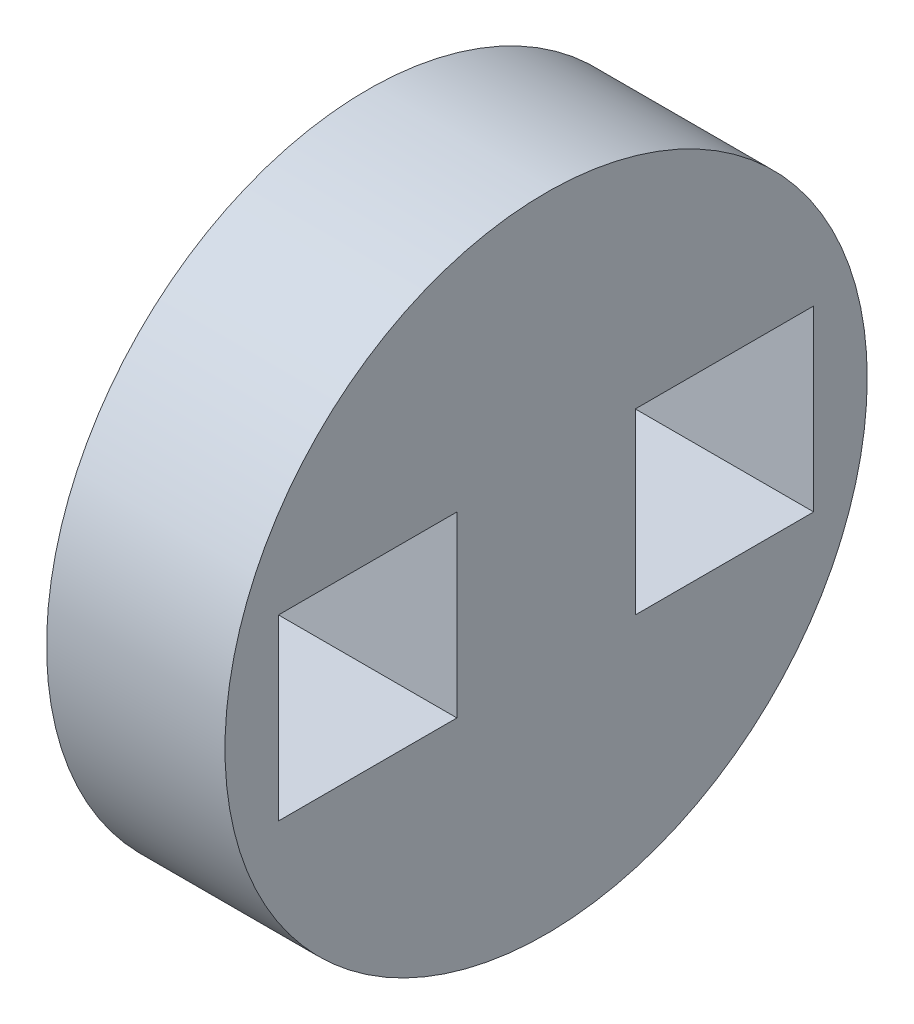
ISO-10303-21;
HEADER;
FILE_DESCRIPTION(('STEP AP214'),'2;1');
FILE_NAME('part.step','',(''),(''),'','','');
FILE_SCHEMA(('AUTOMOTIVE_DESIGN { 1 0 10303 214 1 1 1 1 }'));
ENDSEC;
DATA;
#1=APPLICATION_CONTEXT('core data for automotive mechanical design processes');
#2=APPLICATION_PROTOCOL_DEFINITION('international standard','automotive_design',2000,#1);
#3=PRODUCT_CONTEXT('',#1,'mechanical');
#4=PRODUCT('Part','Part','',(#3));
#5=PRODUCT_RELATED_PRODUCT_CATEGORY('part','',(#4));
#6=PRODUCT_DEFINITION_FORMATION('','',#4);
#7=PRODUCT_DEFINITION_CONTEXT('part definition',#1,'design');
#8=PRODUCT_DEFINITION('design','',#6,#7);
#9=PRODUCT_DEFINITION_SHAPE('','',#8);
#10=(LENGTH_UNIT() NAMED_UNIT(*) SI_UNIT(.MILLI.,.METRE.));
#11=(NAMED_UNIT(*) PLANE_ANGLE_UNIT() SI_UNIT($,.RADIAN.));
#12=(NAMED_UNIT(*) SI_UNIT($,.STERADIAN.) SOLID_ANGLE_UNIT());
#13=UNCERTAINTY_MEASURE_WITH_UNIT(LENGTH_MEASURE(1.E-05),#10,'distance_accuracy_value','');
#14=(GEOMETRIC_REPRESENTATION_CONTEXT(3) GLOBAL_UNCERTAINTY_ASSIGNED_CONTEXT((#13)) GLOBAL_UNIT_ASSIGNED_CONTEXT((#10,
#11,#12)) REPRESENTATION_CONTEXT('',''));
#15=CARTESIAN_POINT('',(0.,0.,0.));
#16=DIRECTION('',(0.,0.,1.));
#17=DIRECTION('',(1.,0.,0.));
#18=AXIS2_PLACEMENT_3D('',#15,#16,#17);
#19=CARTESIAN_POINT('',(6.35,0.,0.));
#20=DIRECTION('',(1.,0.,0.));
#21=DIRECTION('',(0.,0.,-1.));
#22=AXIS2_PLACEMENT_3D('',#19,#20,#21);
#23=PLANE('',#22);
#24=DIRECTION('',(0.,0.,1.));
#25=VECTOR('',#24,1.);
#26=CARTESIAN_POINT('',(6.35,3.175,9.525));
#27=LINE('',#26,#25);
#28=CARTESIAN_POINT('',(6.35,3.175,3.175));
#29=VERTEX_POINT('',#28);
#30=CARTESIAN_POINT('',(6.35,3.175,9.525));
#31=VERTEX_POINT('',#30);
#32=EDGE_CURVE('E136',#29,#31,#27,.T.);
#33=ORIENTED_EDGE('',*,*,#32,.F.);
#34=DIRECTION('',(0.,1.,0.));
#35=VECTOR('',#34,1.);
#36=CARTESIAN_POINT('',(6.35,3.175,3.175));
#37=LINE('',#36,#35);
#38=CARTESIAN_POINT('',(6.35,-3.175,3.175));
#39=VERTEX_POINT('',#38);
#40=EDGE_CURVE('E134',#39,#29,#37,.T.);
#41=ORIENTED_EDGE('',*,*,#40,.F.);
#42=DIRECTION('',(0.,0.,-1.));
#43=VECTOR('',#42,1.);
#44=CARTESIAN_POINT('',(6.35,-3.175,9.525));
#45=LINE('',#44,#43);
#46=CARTESIAN_POINT('',(6.35,-3.175,9.525));
#47=VERTEX_POINT('',#46);
#48=EDGE_CURVE('E142',#47,#39,#45,.T.);
#49=ORIENTED_EDGE('',*,*,#48,.F.);
#50=DIRECTION('',(0.,-1.,0.));
#51=VECTOR('',#50,1.);
#52=CARTESIAN_POINT('',(6.35,3.175,9.525));
#53=LINE('',#52,#51);
#54=EDGE_CURVE('E139',#31,#47,#53,.T.);
#55=ORIENTED_EDGE('',*,*,#54,.F.);
#56=EDGE_LOOP('',(#33,#41,#49,#55));
#57=FACE_BOUND('',#56,.T.);
#58=CARTESIAN_POINT('',(6.35,0.,0.));
#59=DIRECTION('',(1.,0.,0.));
#60=DIRECTION('',(0.,0.,-1.));
#61=AXIS2_PLACEMENT_3D('',#58,#59,#60);
#62=CIRCLE('',#61,11.43);
#63=CARTESIAN_POINT('',(6.35,0.,-11.43));
#64=VERTEX_POINT('',#63);
#65=EDGE_CURVE('E11',#64,#64,#62,.T.);
#66=ORIENTED_EDGE('',*,*,#65,.T.);
#67=EDGE_LOOP('',(#66));
#68=FACE_BOUND('',#67,.T.);
#69=DIRECTION('',(0.,0.,-1.));
#70=VECTOR('',#69,1.);
#71=CARTESIAN_POINT('',(6.35,-3.175,-9.525));
#72=LINE('',#71,#70);
#73=CARTESIAN_POINT('',(6.35,-3.175,-3.175));
#74=VERTEX_POINT('',#73);
#75=CARTESIAN_POINT('',(6.35,-3.175,-9.525));
#76=VERTEX_POINT('',#75);
#77=EDGE_CURVE('E106',#74,#76,#72,.T.);
#78=ORIENTED_EDGE('',*,*,#77,.F.);
#79=DIRECTION('',(0.,-1.,0.));
#80=VECTOR('',#79,1.);
#81=CARTESIAN_POINT('',(6.35,3.175,-3.175));
#82=LINE('',#81,#80);
#83=CARTESIAN_POINT('',(6.35,3.175,-3.175));
#84=VERTEX_POINT('',#83);
#85=EDGE_CURVE('E98',#84,#74,#82,.T.);
#86=ORIENTED_EDGE('',*,*,#85,.F.);
#87=DIRECTION('',(0.,0.,1.));
#88=VECTOR('',#87,1.);
#89=CARTESIAN_POINT('',(6.35,3.175,-9.525));
#90=LINE('',#89,#88);
#91=CARTESIAN_POINT('',(6.35,3.175,-9.525));
#92=VERTEX_POINT('',#91);
#93=EDGE_CURVE('E120',#92,#84,#90,.T.);
#94=ORIENTED_EDGE('',*,*,#93,.F.);
#95=DIRECTION('',(0.,1.,0.));
#96=VECTOR('',#95,1.);
#97=CARTESIAN_POINT('',(6.35,3.175,-9.525));
#98=LINE('',#97,#96);
#99=EDGE_CURVE('E118',#76,#92,#98,.T.);
#100=ORIENTED_EDGE('',*,*,#99,.F.);
#101=EDGE_LOOP('',(#78,#86,#94,#100));
#102=FACE_BOUND('',#101,.T.);
#103=ADVANCED_FACE('F33',(#57,#68,#102),#23,.T.);
#104=CARTESIAN_POINT('',(0.,0.,0.));
#105=DIRECTION('',(1.,0.,0.));
#106=DIRECTION('',(0.,0.,-1.));
#107=AXIS2_PLACEMENT_3D('',#104,#105,#106);
#108=PLANE('',#107);
#109=DIRECTION('',(0.,1.,0.));
#110=VECTOR('',#109,1.);
#111=CARTESIAN_POINT('',(0.,3.175,3.175));
#112=LINE('',#111,#110);
#113=CARTESIAN_POINT('',(0.,-3.175,3.175));
#114=VERTEX_POINT('',#113);
#115=CARTESIAN_POINT('',(0.,3.175,3.175));
#116=VERTEX_POINT('',#115);
#117=EDGE_CURVE('E114',#114,#116,#112,.T.);
#118=ORIENTED_EDGE('',*,*,#117,.T.);
#119=DIRECTION('',(0.,0.,1.));
#120=VECTOR('',#119,1.);
#121=CARTESIAN_POINT('',(0.,3.175,9.525));
#122=LINE('',#121,#120);
#123=CARTESIAN_POINT('',(0.,3.175,9.525));
#124=VERTEX_POINT('',#123);
#125=EDGE_CURVE('E147',#116,#124,#122,.T.);
#126=ORIENTED_EDGE('',*,*,#125,.T.);
#127=DIRECTION('',(0.,-1.,0.));
#128=VECTOR('',#127,1.);
#129=CARTESIAN_POINT('',(0.,3.175,9.525));
#130=LINE('',#129,#128);
#131=CARTESIAN_POINT('',(0.,-3.175,9.525));
#132=VERTEX_POINT('',#131);
#133=EDGE_CURVE('E150',#124,#132,#130,.T.);
#134=ORIENTED_EDGE('',*,*,#133,.T.);
#135=DIRECTION('',(0.,0.,-1.));
#136=VECTOR('',#135,1.);
#137=CARTESIAN_POINT('',(0.,-3.175,9.525));
#138=LINE('',#137,#136);
#139=EDGE_CURVE('E137',#132,#114,#138,.T.);
#140=ORIENTED_EDGE('',*,*,#139,.T.);
#141=EDGE_LOOP('',(#118,#126,#134,#140));
#142=FACE_BOUND('',#141,.T.);
#143=CARTESIAN_POINT('',(0.,0.,0.));
#144=DIRECTION('',(1.,0.,0.));
#145=DIRECTION('',(0.,0.,-1.));
#146=AXIS2_PLACEMENT_3D('',#143,#144,#145);
#147=CIRCLE('',#146,11.43);
#148=CARTESIAN_POINT('',(0.,0.,-11.43));
#149=VERTEX_POINT('',#148);
#150=EDGE_CURVE('E37',#149,#149,#147,.T.);
#151=ORIENTED_EDGE('',*,*,#150,.F.);
#152=EDGE_LOOP('',(#151));
#153=FACE_BOUND('',#152,.T.);
#154=DIRECTION('',(0.,-1.,0.));
#155=VECTOR('',#154,1.);
#156=CARTESIAN_POINT('',(0.,3.175,-3.175));
#157=LINE('',#156,#155);
#158=CARTESIAN_POINT('',(0.,3.175,-3.175));
#159=VERTEX_POINT('',#158);
#160=CARTESIAN_POINT('',(0.,-3.175,-3.175));
#161=VERTEX_POINT('',#160);
#162=EDGE_CURVE('E56',#159,#161,#157,.T.);
#163=ORIENTED_EDGE('',*,*,#162,.T.);
#164=DIRECTION('',(0.,0.,-1.));
#165=VECTOR('',#164,1.);
#166=CARTESIAN_POINT('',(0.,-3.175,-9.525));
#167=LINE('',#166,#165);
#168=CARTESIAN_POINT('',(0.,-3.175,-9.525));
#169=VERTEX_POINT('',#168);
#170=EDGE_CURVE('E113',#161,#169,#167,.T.);
#171=ORIENTED_EDGE('',*,*,#170,.T.);
#172=DIRECTION('',(0.,1.,0.));
#173=VECTOR('',#172,1.);
#174=CARTESIAN_POINT('',(0.,3.175,-9.525));
#175=LINE('',#174,#173);
#176=CARTESIAN_POINT('',(0.,3.175,-9.525));
#177=VERTEX_POINT('',#176);
#178=EDGE_CURVE('E126',#169,#177,#175,.T.);
#179=ORIENTED_EDGE('',*,*,#178,.T.);
#180=DIRECTION('',(0.,0.,1.));
#181=VECTOR('',#180,1.);
#182=CARTESIAN_POINT('',(0.,3.175,-9.525));
#183=LINE('',#182,#181);
#184=EDGE_CURVE('E107',#177,#159,#183,.T.);
#185=ORIENTED_EDGE('',*,*,#184,.T.);
#186=EDGE_LOOP('',(#163,#171,#179,#185));
#187=FACE_BOUND('',#186,.T.);
#188=ADVANCED_FACE('F169',(#142,#153,#187),#108,.F.);
#189=CARTESIAN_POINT('',(6.35,0.,0.));
#190=DIRECTION('',(-1.,0.,0.));
#191=DIRECTION('',(0.,0.,1.));
#192=AXIS2_PLACEMENT_3D('',#189,#190,#191);
#193=CYLINDRICAL_SURFACE('',#192,11.43);
#194=ORIENTED_EDGE('',*,*,#65,.F.);
#195=EDGE_LOOP('',(#194));
#196=FACE_BOUND('',#195,.T.);
#197=ORIENTED_EDGE('',*,*,#150,.T.);
#198=EDGE_LOOP('',(#197));
#199=FACE_BOUND('',#198,.T.);
#200=ADVANCED_FACE('F35',(#196,#199),#193,.T.);
#201=CARTESIAN_POINT('',(6.35,3.175,3.175));
#202=DIRECTION('',(0.,0.,1.));
#203=DIRECTION('',(0.,-1.,0.));
#204=AXIS2_PLACEMENT_3D('',#201,#202,#203);
#205=PLANE('',#204);
#206=ORIENTED_EDGE('',*,*,#117,.F.);
#207=DIRECTION('',(-1.,0.,0.));
#208=VECTOR('',#207,1.);
#209=CARTESIAN_POINT('',(6.35,-3.175,3.175));
#210=LINE('',#209,#208);
#211=EDGE_CURVE('E144',#39,#114,#210,.T.);
#212=ORIENTED_EDGE('',*,*,#211,.F.);
#213=ORIENTED_EDGE('',*,*,#40,.T.);
#214=DIRECTION('',(-1.,0.,0.));
#215=VECTOR('',#214,1.);
#216=CARTESIAN_POINT('',(6.35,3.175,3.175));
#217=LINE('',#216,#215);
#218=EDGE_CURVE('E161',#29,#116,#217,.T.);
#219=ORIENTED_EDGE('',*,*,#218,.T.);
#220=EDGE_LOOP('',(#206,#212,#213,#219));
#221=FACE_BOUND('',#220,.T.);
#222=ADVANCED_FACE('F191',(#221),#205,.T.);
#223=CARTESIAN_POINT('',(6.35,3.175,9.525));
#224=DIRECTION('',(0.,-1.,0.));
#225=DIRECTION('',(0.,0.,-1.));
#226=AXIS2_PLACEMENT_3D('',#223,#224,#225);
#227=PLANE('',#226);
#228=ORIENTED_EDGE('',*,*,#125,.F.);
#229=ORIENTED_EDGE('',*,*,#218,.F.);
#230=ORIENTED_EDGE('',*,*,#32,.T.);
#231=DIRECTION('',(-1.,0.,0.));
#232=VECTOR('',#231,1.);
#233=CARTESIAN_POINT('',(6.35,3.175,9.525));
#234=LINE('',#233,#232);
#235=EDGE_CURVE('E159',#31,#124,#234,.T.);
#236=ORIENTED_EDGE('',*,*,#235,.T.);
#237=EDGE_LOOP('',(#228,#229,#230,#236));
#238=FACE_BOUND('',#237,.T.);
#239=ADVANCED_FACE('F194',(#238),#227,.T.);
#240=CARTESIAN_POINT('',(6.35,3.175,9.525));
#241=DIRECTION('',(0.,0.,-1.));
#242=DIRECTION('',(-1.,0.,0.));
#243=AXIS2_PLACEMENT_3D('',#240,#241,#242);
#244=PLANE('',#243);
#245=ORIENTED_EDGE('',*,*,#133,.F.);
#246=ORIENTED_EDGE('',*,*,#235,.F.);
#247=ORIENTED_EDGE('',*,*,#54,.T.);
#248=DIRECTION('',(-1.,0.,0.));
#249=VECTOR('',#248,1.);
#250=CARTESIAN_POINT('',(6.35,-3.175,9.525));
#251=LINE('',#250,#249);
#252=EDGE_CURVE('E157',#47,#132,#251,.T.);
#253=ORIENTED_EDGE('',*,*,#252,.T.);
#254=EDGE_LOOP('',(#245,#246,#247,#253));
#255=FACE_BOUND('',#254,.T.);
#256=ADVANCED_FACE('F197',(#255),#244,.T.);
#257=CARTESIAN_POINT('',(6.35,-3.175,9.525));
#258=DIRECTION('',(0.,1.,0.));
#259=DIRECTION('',(0.,0.,1.));
#260=AXIS2_PLACEMENT_3D('',#257,#258,#259);
#261=PLANE('',#260);
#262=ORIENTED_EDGE('',*,*,#139,.F.);
#263=ORIENTED_EDGE('',*,*,#252,.F.);
#264=ORIENTED_EDGE('',*,*,#48,.T.);
#265=ORIENTED_EDGE('',*,*,#211,.T.);
#266=EDGE_LOOP('',(#262,#263,#264,#265));
#267=FACE_BOUND('',#266,.T.);
#268=ADVANCED_FACE('F201',(#267),#261,.T.);
#269=CARTESIAN_POINT('',(6.35,3.175,-3.175));
#270=DIRECTION('',(0.,0.,-1.));
#271=DIRECTION('',(0.,1.,0.));
#272=AXIS2_PLACEMENT_3D('',#269,#270,#271);
#273=PLANE('',#272);
#274=ORIENTED_EDGE('',*,*,#162,.F.);
#275=DIRECTION('',(-1.,0.,0.));
#276=VECTOR('',#275,1.);
#277=CARTESIAN_POINT('',(6.35,3.175,-3.175));
#278=LINE('',#277,#276);
#279=EDGE_CURVE('E102',#84,#159,#278,.T.);
#280=ORIENTED_EDGE('',*,*,#279,.F.);
#281=ORIENTED_EDGE('',*,*,#85,.T.);
#282=DIRECTION('',(-1.,0.,0.));
#283=VECTOR('',#282,1.);
#284=CARTESIAN_POINT('',(6.35,-3.175,-3.175));
#285=LINE('',#284,#283);
#286=EDGE_CURVE('E101',#74,#161,#285,.T.);
#287=ORIENTED_EDGE('',*,*,#286,.T.);
#288=EDGE_LOOP('',(#274,#280,#281,#287));
#289=FACE_BOUND('',#288,.T.);
#290=ADVANCED_FACE('F100',(#289),#273,.T.);
#291=CARTESIAN_POINT('',(6.35,-3.175,-9.525));
#292=DIRECTION('',(0.,1.,0.));
#293=DIRECTION('',(0.,0.,1.));
#294=AXIS2_PLACEMENT_3D('',#291,#292,#293);
#295=PLANE('',#294);
#296=ORIENTED_EDGE('',*,*,#170,.F.);
#297=ORIENTED_EDGE('',*,*,#286,.F.);
#298=ORIENTED_EDGE('',*,*,#77,.T.);
#299=DIRECTION('',(-1.,0.,0.));
#300=VECTOR('',#299,1.);
#301=CARTESIAN_POINT('',(6.35,-3.175,-9.525));
#302=LINE('',#301,#300);
#303=EDGE_CURVE('E115',#76,#169,#302,.T.);
#304=ORIENTED_EDGE('',*,*,#303,.T.);
#305=EDGE_LOOP('',(#296,#297,#298,#304));
#306=FACE_BOUND('',#305,.T.);
#307=ADVANCED_FACE('F110',(#306),#295,.T.);
#308=CARTESIAN_POINT('',(6.35,3.175,-9.525));
#309=DIRECTION('',(0.,0.,1.));
#310=DIRECTION('',(1.,0.,0.));
#311=AXIS2_PLACEMENT_3D('',#308,#309,#310);
#312=PLANE('',#311);
#313=ORIENTED_EDGE('',*,*,#178,.F.);
#314=ORIENTED_EDGE('',*,*,#303,.F.);
#315=ORIENTED_EDGE('',*,*,#99,.T.);
#316=DIRECTION('',(-1.,0.,0.));
#317=VECTOR('',#316,1.);
#318=CARTESIAN_POINT('',(6.35,3.175,-9.525));
#319=LINE('',#318,#317);
#320=EDGE_CURVE('E48',#92,#177,#319,.T.);
#321=ORIENTED_EDGE('',*,*,#320,.T.);
#322=EDGE_LOOP('',(#313,#314,#315,#321));
#323=FACE_BOUND('',#322,.T.);
#324=ADVANCED_FACE('F176',(#323),#312,.T.);
#325=CARTESIAN_POINT('',(6.35,3.175,-9.525));
#326=DIRECTION('',(0.,-1.,0.));
#327=DIRECTION('',(0.,0.,-1.));
#328=AXIS2_PLACEMENT_3D('',#325,#326,#327);
#329=PLANE('',#328);
#330=ORIENTED_EDGE('',*,*,#184,.F.);
#331=ORIENTED_EDGE('',*,*,#320,.F.);
#332=ORIENTED_EDGE('',*,*,#93,.T.);
#333=ORIENTED_EDGE('',*,*,#279,.T.);
#334=EDGE_LOOP('',(#330,#331,#332,#333));
#335=FACE_BOUND('',#334,.T.);
#336=ADVANCED_FACE('F174',(#335),#329,.T.);
#337=CLOSED_SHELL('',(#103,#188,#200,#222,#239,#256,#268,#290,#307,#324,#336));
#338=MANIFOLD_SOLID_BREP('B2',#337);
#339=ADVANCED_BREP_SHAPE_REPRESENTATION('',(#18,#338),#14);
#340=SHAPE_DEFINITION_REPRESENTATION(#9,#339);
ENDSEC;
END-ISO-10303-21;
